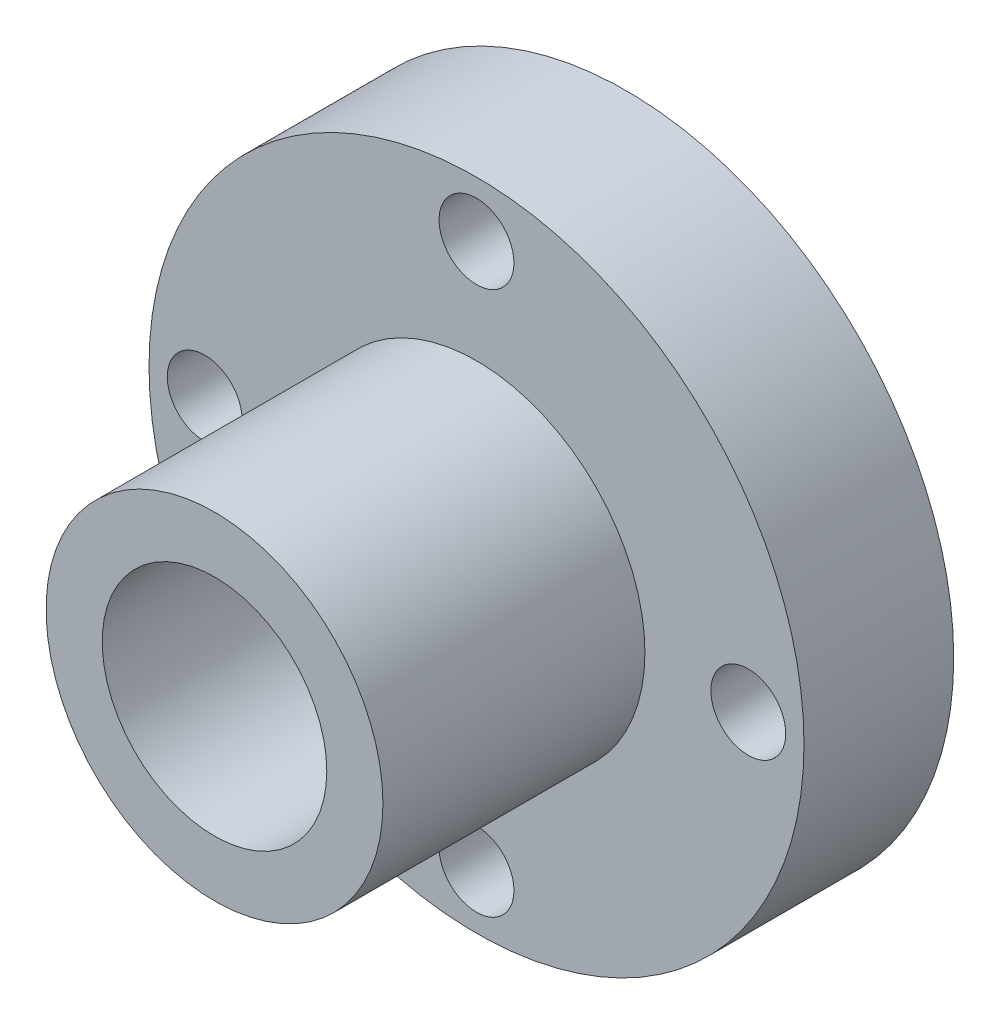
ISO-10303-21;
HEADER;
FILE_DESCRIPTION(('STEP AP214'),'2;1');
FILE_NAME('part.step','',(''),(''),'','','');
FILE_SCHEMA(('AUTOMOTIVE_DESIGN { 1 0 10303 214 1 1 1 1 }'));
ENDSEC;
DATA;
#1=APPLICATION_CONTEXT('core data for automotive mechanical design processes');
#2=APPLICATION_PROTOCOL_DEFINITION('international standard','automotive_design',2000,#1);
#3=PRODUCT_CONTEXT('',#1,'mechanical');
#4=PRODUCT('Part','Part','',(#3));
#5=PRODUCT_RELATED_PRODUCT_CATEGORY('part','',(#4));
#6=PRODUCT_DEFINITION_FORMATION('','',#4);
#7=PRODUCT_DEFINITION_CONTEXT('part definition',#1,'design');
#8=PRODUCT_DEFINITION('design','',#6,#7);
#9=PRODUCT_DEFINITION_SHAPE('','',#8);
#10=(LENGTH_UNIT() NAMED_UNIT(*) SI_UNIT(.MILLI.,.METRE.));
#11=(NAMED_UNIT(*) PLANE_ANGLE_UNIT() SI_UNIT($,.RADIAN.));
#12=(NAMED_UNIT(*) SI_UNIT($,.STERADIAN.) SOLID_ANGLE_UNIT());
#13=UNCERTAINTY_MEASURE_WITH_UNIT(LENGTH_MEASURE(1.E-05),#10,'distance_accuracy_value','');
#14=(GEOMETRIC_REPRESENTATION_CONTEXT(3) GLOBAL_UNCERTAINTY_ASSIGNED_CONTEXT((#13)) GLOBAL_UNIT_ASSIGNED_CONTEXT((#10,
#11,#12)) REPRESENTATION_CONTEXT('',''));
#15=CARTESIAN_POINT('',(0.,0.,0.));
#16=DIRECTION('',(0.,0.,1.));
#17=DIRECTION('',(1.,0.,0.));
#18=AXIS2_PLACEMENT_3D('',#15,#16,#17);
#19=CARTESIAN_POINT('',(0.,0.,8.));
#20=DIRECTION('',(0.,0.,-1.));
#21=DIRECTION('',(-1.,0.,0.));
#22=AXIS2_PLACEMENT_3D('',#19,#20,#21);
#23=CYLINDRICAL_SURFACE('',#22,17.5);
#24=CARTESIAN_POINT('',(0.,0.,8.));
#25=DIRECTION('',(0.,0.,1.));
#26=DIRECTION('',(1.,0.,0.));
#27=AXIS2_PLACEMENT_3D('',#24,#25,#26);
#28=CIRCLE('',#27,17.5);
#29=CARTESIAN_POINT('',(17.5,0.,8.));
#30=VERTEX_POINT('',#29);
#31=EDGE_CURVE('E10',#30,#30,#28,.T.);
#32=ORIENTED_EDGE('',*,*,#31,.F.);
#33=EDGE_LOOP('',(#32));
#34=FACE_BOUND('',#33,.T.);
#35=CARTESIAN_POINT('',(0.,0.,0.));
#36=DIRECTION('',(0.,0.,1.));
#37=DIRECTION('',(1.,0.,0.));
#38=AXIS2_PLACEMENT_3D('',#35,#36,#37);
#39=CIRCLE('',#38,17.5);
#40=CARTESIAN_POINT('',(17.5,0.,0.));
#41=VERTEX_POINT('',#40);
#42=EDGE_CURVE('E38',#41,#41,#39,.T.);
#43=ORIENTED_EDGE('',*,*,#42,.T.);
#44=EDGE_LOOP('',(#43));
#45=FACE_BOUND('',#44,.T.);
#46=ADVANCED_FACE('F35',(#34,#45),#23,.T.);
#47=CARTESIAN_POINT('',(0.,0.,8.));
#48=DIRECTION('',(0.,0.,1.));
#49=DIRECTION('',(1.,0.,0.));
#50=AXIS2_PLACEMENT_3D('',#47,#48,#49);
#51=PLANE('',#50);
#52=CARTESIAN_POINT('',(0.,0.,8.));
#53=DIRECTION('',(0.,0.,1.));
#54=DIRECTION('',(1.,0.,0.));
#55=AXIS2_PLACEMENT_3D('',#52,#53,#54);
#56=CIRCLE('',#55,9.);
#57=CARTESIAN_POINT('',(9.,0.,8.));
#58=VERTEX_POINT('',#57);
#59=EDGE_CURVE('E71',#58,#58,#56,.T.);
#60=ORIENTED_EDGE('',*,*,#59,.F.);
#61=EDGE_LOOP('',(#60));
#62=FACE_BOUND('',#61,.T.);
#63=CARTESIAN_POINT('',(1.43304285226883E-12,14.5231799908072,8.));
#64=DIRECTION('',(0.,0.,1.));
#65=DIRECTION('',(1.,0.,0.));
#66=AXIS2_PLACEMENT_3D('',#63,#64,#65);
#67=CIRCLE('',#66,1.99999999999822);
#68=CARTESIAN_POINT('',(1.99999999999966,14.5231799908072,8.));
#69=VERTEX_POINT('',#68);
#70=EDGE_CURVE('E45',#69,#69,#67,.T.);
#71=ORIENTED_EDGE('',*,*,#70,.F.);
#72=EDGE_LOOP('',(#71));
#73=FACE_BOUND('',#72,.T.);
#74=CARTESIAN_POINT('',(14.5231799908076,-1.02521233911808E-12,8.));
#75=DIRECTION('',(0.,0.,1.));
#76=DIRECTION('',(1.,0.,0.));
#77=AXIS2_PLACEMENT_3D('',#74,#75,#76);
#78=CIRCLE('',#77,1.99999999999855);
#79=CARTESIAN_POINT('',(16.5231799908062,-1.02521233911808E-12,8.));
#80=VERTEX_POINT('',#79);
#81=EDGE_CURVE('E49',#80,#80,#78,.T.);
#82=ORIENTED_EDGE('',*,*,#81,.F.);
#83=EDGE_LOOP('',(#82));
#84=FACE_BOUND('',#83,.T.);
#85=CARTESIAN_POINT('',(-6.17381825967336E-13,-14.5231799908072,8.));
#86=DIRECTION('',(0.,0.,1.));
#87=DIRECTION('',(1.,0.,0.));
#88=AXIS2_PLACEMENT_3D('',#85,#86,#87);
#89=CIRCLE('',#88,1.9999999999991);
#90=CARTESIAN_POINT('',(1.99999999999848,-14.5231799908072,8.));
#91=VERTEX_POINT('',#90);
#92=EDGE_CURVE('E52',#91,#91,#89,.T.);
#93=ORIENTED_EDGE('',*,*,#92,.F.);
#94=EDGE_LOOP('',(#93));
#95=FACE_BOUND('',#94,.T.);
#96=CARTESIAN_POINT('',(-14.5231799908068,1.026990915707E-12,8.));
#97=DIRECTION('',(0.,0.,1.));
#98=DIRECTION('',(1.,0.,0.));
#99=AXIS2_PLACEMENT_3D('',#96,#97,#98);
#100=CIRCLE('',#99,1.99999999999888);
#101=CARTESIAN_POINT('',(-12.523179990808,1.026990915707E-12,8.));
#102=VERTEX_POINT('',#101);
#103=EDGE_CURVE('E55',#102,#102,#100,.T.);
#104=ORIENTED_EDGE('',*,*,#103,.F.);
#105=EDGE_LOOP('',(#104));
#106=FACE_BOUND('',#105,.T.);
#107=ORIENTED_EDGE('',*,*,#31,.T.);
#108=EDGE_LOOP('',(#107));
#109=FACE_BOUND('',#108,.T.);
#110=ADVANCED_FACE('F99',(#62,#73,#84,#95,#106,#109),#51,.T.);
#111=CARTESIAN_POINT('',(0.,0.,0.));
#112=DIRECTION('',(0.,0.,1.));
#113=DIRECTION('',(1.,0.,0.));
#114=AXIS2_PLACEMENT_3D('',#111,#112,#113);
#115=PLANE('',#114);
#116=CARTESIAN_POINT('',(0.,0.,0.));
#117=DIRECTION('',(0.,0.,1.));
#118=DIRECTION('',(1.,0.,0.));
#119=AXIS2_PLACEMENT_3D('',#116,#117,#118);
#120=CIRCLE('',#119,6.);
#121=CARTESIAN_POINT('',(6.,0.,0.));
#122=VERTEX_POINT('',#121);
#123=EDGE_CURVE('E79',#122,#122,#120,.T.);
#124=ORIENTED_EDGE('',*,*,#123,.T.);
#125=EDGE_LOOP('',(#124));
#126=FACE_BOUND('',#125,.T.);
#127=CARTESIAN_POINT('',(1.43304285226883E-12,14.5231799908072,0.));
#128=DIRECTION('',(0.,0.,1.));
#129=DIRECTION('',(1.,0.,0.));
#130=AXIS2_PLACEMENT_3D('',#127,#128,#129);
#131=CIRCLE('',#130,1.99999999999822);
#132=CARTESIAN_POINT('',(1.99999999999966,14.5231799908072,0.));
#133=VERTEX_POINT('',#132);
#134=EDGE_CURVE('E58',#133,#133,#131,.T.);
#135=ORIENTED_EDGE('',*,*,#134,.T.);
#136=EDGE_LOOP('',(#135));
#137=FACE_BOUND('',#136,.T.);
#138=CARTESIAN_POINT('',(14.5231799908076,-1.02521233911808E-12,0.));
#139=DIRECTION('',(0.,0.,1.));
#140=DIRECTION('',(1.,0.,0.));
#141=AXIS2_PLACEMENT_3D('',#138,#139,#140);
#142=CIRCLE('',#141,1.99999999999855);
#143=CARTESIAN_POINT('',(16.5231799908062,-1.02521233911808E-12,0.));
#144=VERTEX_POINT('',#143);
#145=EDGE_CURVE('E66',#144,#144,#142,.T.);
#146=ORIENTED_EDGE('',*,*,#145,.T.);
#147=EDGE_LOOP('',(#146));
#148=FACE_BOUND('',#147,.T.);
#149=CARTESIAN_POINT('',(-6.17381825967336E-13,-14.5231799908072,0.));
#150=DIRECTION('',(0.,0.,1.));
#151=DIRECTION('',(1.,0.,0.));
#152=AXIS2_PLACEMENT_3D('',#149,#150,#151);
#153=CIRCLE('',#152,1.9999999999991);
#154=CARTESIAN_POINT('',(1.99999999999848,-14.5231799908072,0.));
#155=VERTEX_POINT('',#154);
#156=EDGE_CURVE('E62',#155,#155,#153,.T.);
#157=ORIENTED_EDGE('',*,*,#156,.T.);
#158=EDGE_LOOP('',(#157));
#159=FACE_BOUND('',#158,.T.);
#160=CARTESIAN_POINT('',(-14.5231799908068,1.026990915707E-12,0.));
#161=DIRECTION('',(0.,0.,1.));
#162=DIRECTION('',(1.,0.,0.));
#163=AXIS2_PLACEMENT_3D('',#160,#161,#162);
#164=CIRCLE('',#163,1.99999999999888);
#165=CARTESIAN_POINT('',(-12.523179990808,1.026990915707E-12,0.));
#166=VERTEX_POINT('',#165);
#167=EDGE_CURVE('E59',#166,#166,#164,.T.);
#168=ORIENTED_EDGE('',*,*,#167,.T.);
#169=EDGE_LOOP('',(#168));
#170=FACE_BOUND('',#169,.T.);
#171=ORIENTED_EDGE('',*,*,#42,.F.);
#172=EDGE_LOOP('',(#171));
#173=FACE_BOUND('',#172,.T.);
#174=ADVANCED_FACE('F83',(#126,#137,#148,#159,#170,#173),#115,.F.);
#175=CARTESIAN_POINT('',(-14.5231799908068,1.026990915707E-12,0.));
#176=DIRECTION('',(0.,0.,1.));
#177=DIRECTION('',(1.,0.,0.));
#178=AXIS2_PLACEMENT_3D('',#175,#176,#177);
#179=CYLINDRICAL_SURFACE('',#178,1.99999999999888);
#180=ORIENTED_EDGE('',*,*,#103,.T.);
#181=EDGE_LOOP('',(#180));
#182=FACE_BOUND('',#181,.T.);
#183=ORIENTED_EDGE('',*,*,#167,.F.);
#184=EDGE_LOOP('',(#183));
#185=FACE_BOUND('',#184,.T.);
#186=ADVANCED_FACE('F110',(#182,#185),#179,.F.);
#187=CARTESIAN_POINT('',(-6.17381825967336E-13,-14.5231799908072,0.));
#188=DIRECTION('',(0.,0.,1.));
#189=DIRECTION('',(1.,0.,0.));
#190=AXIS2_PLACEMENT_3D('',#187,#188,#189);
#191=CYLINDRICAL_SURFACE('',#190,1.9999999999991);
#192=ORIENTED_EDGE('',*,*,#92,.T.);
#193=EDGE_LOOP('',(#192));
#194=FACE_BOUND('',#193,.T.);
#195=ORIENTED_EDGE('',*,*,#156,.F.);
#196=EDGE_LOOP('',(#195));
#197=FACE_BOUND('',#196,.T.);
#198=ADVANCED_FACE('F114',(#194,#197),#191,.F.);
#199=CARTESIAN_POINT('',(14.5231799908076,-1.02521233911808E-12,0.));
#200=DIRECTION('',(0.,0.,1.));
#201=DIRECTION('',(1.,0.,0.));
#202=AXIS2_PLACEMENT_3D('',#199,#200,#201);
#203=CYLINDRICAL_SURFACE('',#202,1.99999999999855);
#204=ORIENTED_EDGE('',*,*,#81,.T.);
#205=EDGE_LOOP('',(#204));
#206=FACE_BOUND('',#205,.T.);
#207=ORIENTED_EDGE('',*,*,#145,.F.);
#208=EDGE_LOOP('',(#207));
#209=FACE_BOUND('',#208,.T.);
#210=ADVANCED_FACE('F120',(#206,#209),#203,.F.);
#211=CARTESIAN_POINT('',(1.43304285226883E-12,14.5231799908072,0.));
#212=DIRECTION('',(0.,0.,1.));
#213=DIRECTION('',(1.,0.,0.));
#214=AXIS2_PLACEMENT_3D('',#211,#212,#213);
#215=CYLINDRICAL_SURFACE('',#214,1.99999999999822);
#216=ORIENTED_EDGE('',*,*,#70,.T.);
#217=EDGE_LOOP('',(#216));
#218=FACE_BOUND('',#217,.T.);
#219=ORIENTED_EDGE('',*,*,#134,.F.);
#220=EDGE_LOOP('',(#219));
#221=FACE_BOUND('',#220,.T.);
#222=ADVANCED_FACE('F124',(#218,#221),#215,.F.);
#223=CARTESIAN_POINT('',(0.,0.,22.));
#224=DIRECTION('',(0.,0.,1.));
#225=DIRECTION('',(1.,0.,0.));
#226=AXIS2_PLACEMENT_3D('',#223,#224,#225);
#227=PLANE('',#226);
#228=CARTESIAN_POINT('',(0.,0.,22.));
#229=DIRECTION('',(0.,0.,1.));
#230=DIRECTION('',(1.,0.,0.));
#231=AXIS2_PLACEMENT_3D('',#228,#229,#230);
#232=CIRCLE('',#231,9.);
#233=CARTESIAN_POINT('',(9.,0.,22.));
#234=VERTEX_POINT('',#233);
#235=EDGE_CURVE('E63',#234,#234,#232,.T.);
#236=ORIENTED_EDGE('',*,*,#235,.T.);
#237=EDGE_LOOP('',(#236));
#238=FACE_BOUND('',#237,.T.);
#239=CARTESIAN_POINT('',(0.,0.,22.));
#240=DIRECTION('',(0.,0.,1.));
#241=DIRECTION('',(1.,0.,0.));
#242=AXIS2_PLACEMENT_3D('',#239,#240,#241);
#243=CIRCLE('',#242,6.);
#244=CARTESIAN_POINT('',(6.,0.,22.));
#245=VERTEX_POINT('',#244);
#246=EDGE_CURVE('E74',#245,#245,#243,.T.);
#247=ORIENTED_EDGE('',*,*,#246,.F.);
#248=EDGE_LOOP('',(#247));
#249=FACE_BOUND('',#248,.T.);
#250=ADVANCED_FACE('F94',(#238,#249),#227,.T.);
#251=CARTESIAN_POINT('',(0.,0.,22.));
#252=DIRECTION('',(0.,0.,-1.));
#253=DIRECTION('',(-1.,0.,0.));
#254=AXIS2_PLACEMENT_3D('',#251,#252,#253);
#255=CYLINDRICAL_SURFACE('',#254,9.);
#256=ORIENTED_EDGE('',*,*,#235,.F.);
#257=EDGE_LOOP('',(#256));
#258=FACE_BOUND('',#257,.T.);
#259=ORIENTED_EDGE('',*,*,#59,.T.);
#260=EDGE_LOOP('',(#259));
#261=FACE_BOUND('',#260,.T.);
#262=ADVANCED_FACE('F88',(#258,#261),#255,.T.);
#263=CARTESIAN_POINT('',(0.,0.,22.));
#264=DIRECTION('',(0.,0.,-1.));
#265=DIRECTION('',(-1.,0.,0.));
#266=AXIS2_PLACEMENT_3D('',#263,#264,#265);
#267=CYLINDRICAL_SURFACE('',#266,6.);
#268=ORIENTED_EDGE('',*,*,#246,.T.);
#269=EDGE_LOOP('',(#268));
#270=FACE_BOUND('',#269,.T.);
#271=ORIENTED_EDGE('',*,*,#123,.F.);
#272=EDGE_LOOP('',(#271));
#273=FACE_BOUND('',#272,.T.);
#274=ADVANCED_FACE('F86',(#270,#273),#267,.F.);
#275=CLOSED_SHELL('',(#46,#110,#174,#186,#198,#210,#222,#250,#262,#274));
#276=MANIFOLD_SOLID_BREP('B2',#275);
#277=ADVANCED_BREP_SHAPE_REPRESENTATION('',(#18,#276),#14);
#278=SHAPE_DEFINITION_REPRESENTATION(#9,#277);
ENDSEC;
END-ISO-10303-21;
